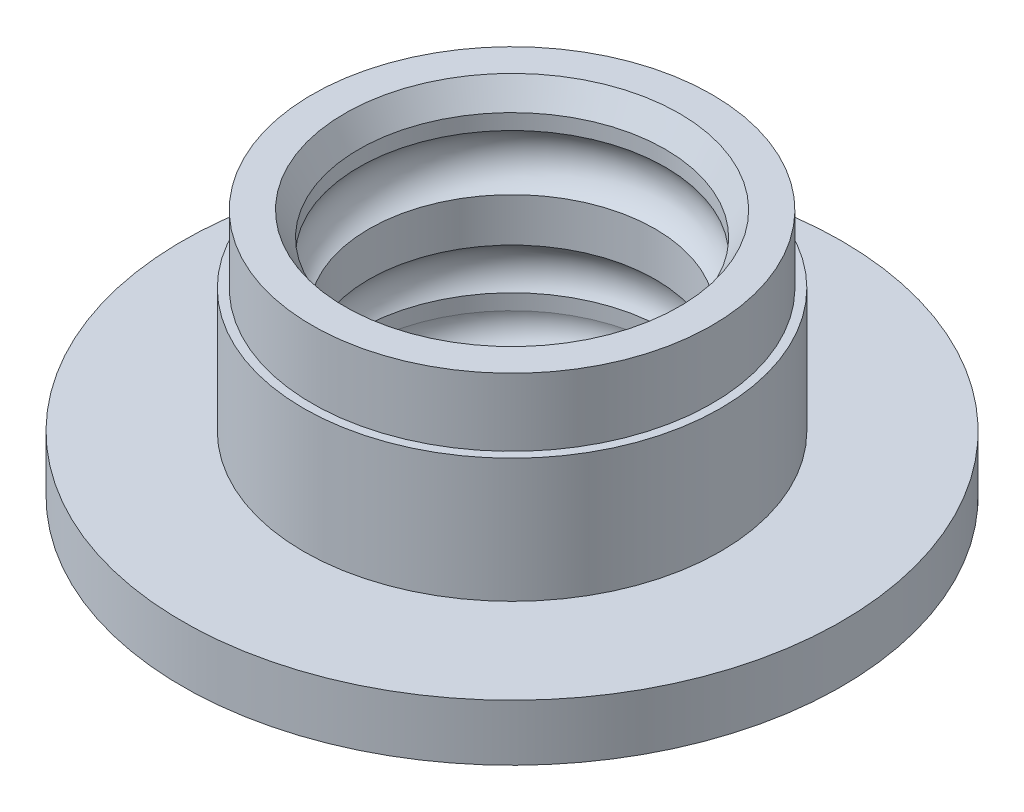
ISO-10303-21;
HEADER;
FILE_DESCRIPTION(('STEP AP214'),'2;1');
FILE_NAME('part.step','',(''),(''),'','','');
FILE_SCHEMA(('AUTOMOTIVE_DESIGN { 1 0 10303 214 1 1 1 1 }'));
ENDSEC;
DATA;
#1=APPLICATION_CONTEXT('core data for automotive mechanical design processes');
#2=APPLICATION_PROTOCOL_DEFINITION('international standard','automotive_design',2000,#1);
#3=PRODUCT_CONTEXT('',#1,'mechanical');
#4=PRODUCT('Part','Part','',(#3));
#5=PRODUCT_RELATED_PRODUCT_CATEGORY('part','',(#4));
#6=PRODUCT_DEFINITION_FORMATION('','',#4);
#7=PRODUCT_DEFINITION_CONTEXT('part definition',#1,'design');
#8=PRODUCT_DEFINITION('design','',#6,#7);
#9=PRODUCT_DEFINITION_SHAPE('','',#8);
#10=(LENGTH_UNIT() NAMED_UNIT(*) SI_UNIT(.MILLI.,.METRE.));
#11=(NAMED_UNIT(*) PLANE_ANGLE_UNIT() SI_UNIT($,.RADIAN.));
#12=(NAMED_UNIT(*) SI_UNIT($,.STERADIAN.) SOLID_ANGLE_UNIT());
#13=UNCERTAINTY_MEASURE_WITH_UNIT(LENGTH_MEASURE(1.E-05),#10,'distance_accuracy_value','');
#14=(GEOMETRIC_REPRESENTATION_CONTEXT(3) GLOBAL_UNCERTAINTY_ASSIGNED_CONTEXT((#13)) GLOBAL_UNIT_ASSIGNED_CONTEXT((#10,
#11,#12)) REPRESENTATION_CONTEXT('',''));
#15=CARTESIAN_POINT('',(0.,0.,0.));
#16=DIRECTION('',(0.,0.,1.));
#17=DIRECTION('',(1.,0.,0.));
#18=AXIS2_PLACEMENT_3D('',#15,#16,#17);
#19=CARTESIAN_POINT('',(35.5,1.7405594653392,0.));
#20=DIRECTION('',(0.,1.,0.));
#21=DIRECTION('',(0.,0.,1.));
#22=AXIS2_PLACEMENT_3D('',#19,#20,#21);
#23=PLANE('',#22);
#24=CARTESIAN_POINT('',(0.,1.7405594653392,0.));
#25=DIRECTION('',(0.,-1.,0.));
#26=DIRECTION('',(0.,0.,-1.));
#27=AXIS2_PLACEMENT_3D('',#24,#25,#26);
#28=CIRCLE('',#27,35.5);
#29=CARTESIAN_POINT('',(0.,1.7405594653392,-35.5));
#30=VERTEX_POINT('',#29);
#31=EDGE_CURVE('E10',#30,#30,#28,.T.);
#32=ORIENTED_EDGE('',*,*,#31,.T.);
#33=EDGE_LOOP('',(#32));
#34=FACE_BOUND('',#33,.T.);
#35=CARTESIAN_POINT('',(0.,1.7405594653392,0.));
#36=DIRECTION('',(0.,-1.,0.));
#37=DIRECTION('',(0.,0.,-1.));
#38=AXIS2_PLACEMENT_3D('',#35,#36,#37);
#39=CIRCLE('',#38,37.);
#40=CARTESIAN_POINT('',(0.,1.7405594653392,-37.));
#41=VERTEX_POINT('',#40);
#42=EDGE_CURVE('E98',#41,#41,#39,.T.);
#43=ORIENTED_EDGE('',*,*,#42,.F.);
#44=EDGE_LOOP('',(#43));
#45=FACE_BOUND('',#44,.T.);
#46=ADVANCED_FACE('F31',(#34,#45),#23,.T.);
#47=CARTESIAN_POINT('',(0.,-64.8430626057529,0.));
#48=DIRECTION('',(0.,-1.,0.));
#49=DIRECTION('',(0.,0.,-1.));
#50=AXIS2_PLACEMENT_3D('',#47,#48,#49);
#51=CYLINDRICAL_SURFACE('',#50,35.5);
#52=CARTESIAN_POINT('',(0.,13.7405594653392,0.));
#53=DIRECTION('',(0.,-1.,0.));
#54=DIRECTION('',(0.,0.,-1.));
#55=AXIS2_PLACEMENT_3D('',#52,#53,#54);
#56=CIRCLE('',#55,35.5);
#57=CARTESIAN_POINT('',(0.,13.7405594653392,-35.5));
#58=VERTEX_POINT('',#57);
#59=EDGE_CURVE('E37',#58,#58,#56,.T.);
#60=ORIENTED_EDGE('',*,*,#59,.T.);
#61=EDGE_LOOP('',(#60));
#62=FACE_BOUND('',#61,.T.);
#63=ORIENTED_EDGE('',*,*,#31,.F.);
#64=EDGE_LOOP('',(#63));
#65=FACE_BOUND('',#64,.T.);
#66=ADVANCED_FACE('F106',(#62,#65),#51,.T.);
#67=CARTESIAN_POINT('',(29.7,13.7405594653392,0.));
#68=DIRECTION('',(0.,1.,0.));
#69=DIRECTION('',(0.,0.,1.));
#70=AXIS2_PLACEMENT_3D('',#67,#68,#69);
#71=PLANE('',#70);
#72=CARTESIAN_POINT('',(0.,13.7405594653392,0.));
#73=DIRECTION('',(0.,-1.,0.));
#74=DIRECTION('',(0.,0.,-1.));
#75=AXIS2_PLACEMENT_3D('',#72,#73,#74);
#76=CIRCLE('',#75,29.7);
#77=CARTESIAN_POINT('',(0.,13.7405594653392,-29.7));
#78=VERTEX_POINT('',#77);
#79=EDGE_CURVE('E41',#78,#78,#76,.T.);
#80=ORIENTED_EDGE('',*,*,#79,.T.);
#81=EDGE_LOOP('',(#80));
#82=FACE_BOUND('',#81,.T.);
#83=ORIENTED_EDGE('',*,*,#59,.F.);
#84=EDGE_LOOP('',(#83));
#85=FACE_BOUND('',#84,.T.);
#86=ADVANCED_FACE('F110',(#82,#85),#71,.T.);
#87=CARTESIAN_POINT('',(0.,13.7405594653392,0.));
#88=DIRECTION('',(0.,1.,0.));
#89=DIRECTION('',(0.,0.,1.));
#90=AXIS2_PLACEMENT_3D('',#87,#88,#89);
#91=CONICAL_SURFACE('',#90,29.7,0.533624722812647);
#92=CARTESIAN_POINT('',(0.,9.49055946533919,0.));
#93=DIRECTION('',(0.,-1.,0.));
#94=DIRECTION('',(0.,0.,-1.));
#95=AXIS2_PLACEMENT_3D('',#92,#93,#94);
#96=CIRCLE('',#95,27.1891149492495);
#97=CARTESIAN_POINT('',(0.,9.49055946533919,-27.1891149492495));
#98=VERTEX_POINT('',#97);
#99=EDGE_CURVE('E45',#98,#98,#96,.T.);
#100=ORIENTED_EDGE('',*,*,#99,.T.);
#101=EDGE_LOOP('',(#100));
#102=FACE_BOUND('',#101,.T.);
#103=ORIENTED_EDGE('',*,*,#79,.F.);
#104=EDGE_LOOP('',(#103));
#105=FACE_BOUND('',#104,.T.);
#106=ADVANCED_FACE('F114',(#102,#105),#91,.F.);
#107=CARTESIAN_POINT('',(0.,-64.8430626057529,0.));
#108=DIRECTION('',(0.,-1.,0.));
#109=DIRECTION('',(0.,0.,-1.));
#110=AXIS2_PLACEMENT_3D('',#107,#108,#109);
#111=CYLINDRICAL_SURFACE('',#110,27.1891149492495);
#112=CARTESIAN_POINT('',(0.,6.74055946533919,0.));
#113=DIRECTION('',(0.,-1.,0.));
#114=DIRECTION('',(0.,0.,-1.));
#115=AXIS2_PLACEMENT_3D('',#112,#113,#114);
#116=CIRCLE('',#115,27.1891149492495);
#117=CARTESIAN_POINT('',(0.,6.74055946533919,-27.1891149492495));
#118=VERTEX_POINT('',#117);
#119=EDGE_CURVE('E50',#118,#118,#116,.T.);
#120=ORIENTED_EDGE('',*,*,#119,.T.);
#121=EDGE_LOOP('',(#120));
#122=FACE_BOUND('',#121,.T.);
#123=ORIENTED_EDGE('',*,*,#99,.F.);
#124=EDGE_LOOP('',(#123));
#125=FACE_BOUND('',#124,.T.);
#126=ADVANCED_FACE('F121',(#122,#125),#111,.F.);
#127=CARTESIAN_POINT('',(0.,3.19642096882552,0.));
#128=DIRECTION('',(0.,-1.,0.));
#129=DIRECTION('',(0.,0.,-1.));
#130=AXIS2_PLACEMENT_3D('',#127,#128,#129);
#131=TOROIDAL_SURFACE('',#130,22.6612476458129,5.75);
#132=CARTESIAN_POINT('',(0.,-1.85944053466081,0.));
#133=DIRECTION('',(0.,-1.,0.));
#134=DIRECTION('',(0.,0.,-1.));
#135=AXIS2_PLACEMENT_3D('',#132,#133,#134);
#136=CIRCLE('',#135,25.4);
#137=CARTESIAN_POINT('',(0.,-1.85944053466081,-25.4));
#138=VERTEX_POINT('',#137);
#139=EDGE_CURVE('E53',#138,#138,#136,.T.);
#140=ORIENTED_EDGE('',*,*,#139,.T.);
#141=EDGE_LOOP('',(#140));
#142=FACE_BOUND('',#141,.T.);
#143=ORIENTED_EDGE('',*,*,#119,.F.);
#144=EDGE_LOOP('',(#143));
#145=FACE_BOUND('',#144,.T.);
#146=ADVANCED_FACE('F125',(#142,#145),#131,.F.);
#147=CARTESIAN_POINT('',(0.,-64.8430626057529,0.));
#148=DIRECTION('',(0.,-1.,0.));
#149=DIRECTION('',(0.,0.,-1.));
#150=AXIS2_PLACEMENT_3D('',#147,#148,#149);
#151=CYLINDRICAL_SURFACE('',#150,25.4);
#152=CARTESIAN_POINT('',(0.,-9.6094405346608,0.));
#153=DIRECTION('',(0.,-1.,0.));
#154=DIRECTION('',(0.,0.,-1.));
#155=AXIS2_PLACEMENT_3D('',#152,#153,#154);
#156=CIRCLE('',#155,25.4);
#157=CARTESIAN_POINT('',(0.,-9.6094405346608,-25.4));
#158=VERTEX_POINT('',#157);
#159=EDGE_CURVE('E56',#158,#158,#156,.T.);
#160=ORIENTED_EDGE('',*,*,#159,.T.);
#161=EDGE_LOOP('',(#160));
#162=FACE_BOUND('',#161,.T.);
#163=ORIENTED_EDGE('',*,*,#139,.F.);
#164=EDGE_LOOP('',(#163));
#165=FACE_BOUND('',#164,.T.);
#166=ADVANCED_FACE('F129',(#162,#165),#151,.F.);
#167=CARTESIAN_POINT('',(0.,-14.6653020381471,0.));
#168=DIRECTION('',(0.,-1.,0.));
#169=DIRECTION('',(0.,0.,-1.));
#170=AXIS2_PLACEMENT_3D('',#167,#168,#169);
#171=TOROIDAL_SURFACE('',#170,22.6612476458129,5.75);
#172=CARTESIAN_POINT('',(0.,-18.2094405346608,0.));
#173=DIRECTION('',(0.,-1.,0.));
#174=DIRECTION('',(0.,0.,-1.));
#175=AXIS2_PLACEMENT_3D('',#172,#173,#174);
#176=CIRCLE('',#175,27.1891149492495);
#177=CARTESIAN_POINT('',(0.,-18.2094405346608,-27.1891149492495));
#178=VERTEX_POINT('',#177);
#179=EDGE_CURVE('E59',#178,#178,#176,.T.);
#180=ORIENTED_EDGE('',*,*,#179,.T.);
#181=EDGE_LOOP('',(#180));
#182=FACE_BOUND('',#181,.T.);
#183=ORIENTED_EDGE('',*,*,#159,.F.);
#184=EDGE_LOOP('',(#183));
#185=FACE_BOUND('',#184,.T.);
#186=ADVANCED_FACE('F133',(#182,#185),#171,.F.);
#187=CARTESIAN_POINT('',(0.,-64.8430626057529,0.));
#188=DIRECTION('',(0.,-1.,0.));
#189=DIRECTION('',(0.,0.,-1.));
#190=AXIS2_PLACEMENT_3D('',#187,#188,#189);
#191=CYLINDRICAL_SURFACE('',#190,27.1891149492495);
#192=CARTESIAN_POINT('',(0.,-20.9594405346608,0.));
#193=DIRECTION('',(0.,-1.,0.));
#194=DIRECTION('',(0.,0.,-1.));
#195=AXIS2_PLACEMENT_3D('',#192,#193,#194);
#196=CIRCLE('',#195,27.1891149492495);
#197=CARTESIAN_POINT('',(0.,-20.9594405346608,-27.1891149492495));
#198=VERTEX_POINT('',#197);
#199=EDGE_CURVE('E62',#198,#198,#196,.T.);
#200=ORIENTED_EDGE('',*,*,#199,.T.);
#201=EDGE_LOOP('',(#200));
#202=FACE_BOUND('',#201,.T.);
#203=ORIENTED_EDGE('',*,*,#179,.F.);
#204=EDGE_LOOP('',(#203));
#205=FACE_BOUND('',#204,.T.);
#206=ADVANCED_FACE('F137',(#202,#205),#191,.F.);
#207=CARTESIAN_POINT('',(0.,-21.908439755999,0.));
#208=DIRECTION('',(0.,-1.,0.));
#209=DIRECTION('',(0.,0.,-1.));
#210=AXIS2_PLACEMENT_3D('',#207,#208,#209);
#211=TOROIDAL_SURFACE('',#210,22.280000927565,5.);
#212=CARTESIAN_POINT('',(0.,-25.4594405346608,0.));
#213=DIRECTION('',(0.,-1.,0.));
#214=DIRECTION('',(0.,0.,-1.));
#215=AXIS2_PLACEMENT_3D('',#212,#213,#214);
#216=CIRCLE('',#215,25.8);
#217=CARTESIAN_POINT('',(0.,-25.4594405346608,-25.8));
#218=VERTEX_POINT('',#217);
#219=EDGE_CURVE('E65',#218,#218,#216,.T.);
#220=ORIENTED_EDGE('',*,*,#219,.T.);
#221=EDGE_LOOP('',(#220));
#222=FACE_BOUND('',#221,.T.);
#223=ORIENTED_EDGE('',*,*,#199,.F.);
#224=EDGE_LOOP('',(#223));
#225=FACE_BOUND('',#224,.T.);
#226=ADVANCED_FACE('F141',(#222,#225),#211,.F.);
#227=CARTESIAN_POINT('',(0.,-64.8430626057529,0.));
#228=DIRECTION('',(0.,-1.,0.));
#229=DIRECTION('',(0.,0.,-1.));
#230=AXIS2_PLACEMENT_3D('',#227,#228,#229);
#231=CYLINDRICAL_SURFACE('',#230,25.8);
#232=CARTESIAN_POINT('',(0.,-36.2594405346608,0.));
#233=DIRECTION('',(0.,-1.,0.));
#234=DIRECTION('',(0.,0.,-1.));
#235=AXIS2_PLACEMENT_3D('',#232,#233,#234);
#236=CIRCLE('',#235,25.8);
#237=CARTESIAN_POINT('',(0.,-36.2594405346608,-25.8));
#238=VERTEX_POINT('',#237);
#239=EDGE_CURVE('E68',#238,#238,#236,.T.);
#240=ORIENTED_EDGE('',*,*,#239,.T.);
#241=EDGE_LOOP('',(#240));
#242=FACE_BOUND('',#241,.T.);
#243=ORIENTED_EDGE('',*,*,#219,.F.);
#244=EDGE_LOOP('',(#243));
#245=FACE_BOUND('',#244,.T.);
#246=ADVANCED_FACE('F145',(#242,#245),#231,.F.);
#247=CARTESIAN_POINT('',(26.,-36.2594405346608,0.));
#248=DIRECTION('',(0.,-1.,0.));
#249=DIRECTION('',(0.,0.,-1.));
#250=AXIS2_PLACEMENT_3D('',#247,#248,#249);
#251=PLANE('',#250);
#252=CARTESIAN_POINT('',(0.,-36.2594405346608,0.));
#253=DIRECTION('',(0.,-1.,0.));
#254=DIRECTION('',(0.,0.,-1.));
#255=AXIS2_PLACEMENT_3D('',#252,#253,#254);
#256=CIRCLE('',#255,26.);
#257=CARTESIAN_POINT('',(0.,-36.2594405346608,-26.));
#258=VERTEX_POINT('',#257);
#259=EDGE_CURVE('E71',#258,#258,#256,.T.);
#260=ORIENTED_EDGE('',*,*,#259,.T.);
#261=EDGE_LOOP('',(#260));
#262=FACE_BOUND('',#261,.T.);
#263=ORIENTED_EDGE('',*,*,#239,.F.);
#264=EDGE_LOOP('',(#263));
#265=FACE_BOUND('',#264,.T.);
#266=ADVANCED_FACE('F149',(#262,#265),#251,.T.);
#267=CARTESIAN_POINT('',(0.,-64.8430626057529,0.));
#268=DIRECTION('',(0.,-1.,0.));
#269=DIRECTION('',(0.,0.,-1.));
#270=AXIS2_PLACEMENT_3D('',#267,#268,#269);
#271=CYLINDRICAL_SURFACE('',#270,26.);
#272=CARTESIAN_POINT('',(0.,-47.2594405346608,0.));
#273=DIRECTION('',(0.,-1.,0.));
#274=DIRECTION('',(0.,0.,-1.));
#275=AXIS2_PLACEMENT_3D('',#272,#273,#274);
#276=CIRCLE('',#275,26.);
#277=CARTESIAN_POINT('',(0.,-47.2594405346608,-26.));
#278=VERTEX_POINT('',#277);
#279=EDGE_CURVE('E74',#278,#278,#276,.T.);
#280=ORIENTED_EDGE('',*,*,#279,.T.);
#281=EDGE_LOOP('',(#280));
#282=FACE_BOUND('',#281,.T.);
#283=ORIENTED_EDGE('',*,*,#259,.F.);
#284=EDGE_LOOP('',(#283));
#285=FACE_BOUND('',#284,.T.);
#286=ADVANCED_FACE('F153',(#282,#285),#271,.F.);
#287=CARTESIAN_POINT('',(29.,-47.2594405346608,0.));
#288=DIRECTION('',(0.,-1.,0.));
#289=DIRECTION('',(0.,0.,-1.));
#290=AXIS2_PLACEMENT_3D('',#287,#288,#289);
#291=PLANE('',#290);
#292=CARTESIAN_POINT('',(0.,-47.2594405346608,0.));
#293=DIRECTION('',(0.,-1.,0.));
#294=DIRECTION('',(0.,0.,-1.));
#295=AXIS2_PLACEMENT_3D('',#292,#293,#294);
#296=CIRCLE('',#295,29.);
#297=CARTESIAN_POINT('',(0.,-47.2594405346608,-29.));
#298=VERTEX_POINT('',#297);
#299=EDGE_CURVE('E77',#298,#298,#296,.T.);
#300=ORIENTED_EDGE('',*,*,#299,.T.);
#301=EDGE_LOOP('',(#300));
#302=FACE_BOUND('',#301,.T.);
#303=ORIENTED_EDGE('',*,*,#279,.F.);
#304=EDGE_LOOP('',(#303));
#305=FACE_BOUND('',#304,.T.);
#306=ADVANCED_FACE('F157',(#302,#305),#291,.T.);
#307=CARTESIAN_POINT('',(0.,-64.8430626057529,0.));
#308=DIRECTION('',(0.,-1.,0.));
#309=DIRECTION('',(0.,0.,-1.));
#310=AXIS2_PLACEMENT_3D('',#307,#308,#309);
#311=CYLINDRICAL_SURFACE('',#310,29.);
#312=CARTESIAN_POINT('',(0.,-35.2594405346608,0.));
#313=DIRECTION('',(0.,-1.,0.));
#314=DIRECTION('',(0.,0.,-1.));
#315=AXIS2_PLACEMENT_3D('',#312,#313,#314);
#316=CIRCLE('',#315,29.);
#317=CARTESIAN_POINT('',(0.,-35.2594405346608,-29.));
#318=VERTEX_POINT('',#317);
#319=EDGE_CURVE('E80',#318,#318,#316,.T.);
#320=ORIENTED_EDGE('',*,*,#319,.T.);
#321=EDGE_LOOP('',(#320));
#322=FACE_BOUND('',#321,.T.);
#323=ORIENTED_EDGE('',*,*,#299,.F.);
#324=EDGE_LOOP('',(#323));
#325=FACE_BOUND('',#324,.T.);
#326=ADVANCED_FACE('F161',(#322,#325),#311,.T.);
#327=CARTESIAN_POINT('',(29.5,-35.2594405346608,0.));
#328=DIRECTION('',(0.,-1.,0.));
#329=DIRECTION('',(0.,0.,-1.));
#330=AXIS2_PLACEMENT_3D('',#327,#328,#329);
#331=PLANE('',#330);
#332=CARTESIAN_POINT('',(0.,-35.2594405346608,0.));
#333=DIRECTION('',(0.,-1.,0.));
#334=DIRECTION('',(0.,0.,-1.));
#335=AXIS2_PLACEMENT_3D('',#332,#333,#334);
#336=CIRCLE('',#335,29.5);
#337=CARTESIAN_POINT('',(0.,-35.2594405346608,-29.5));
#338=VERTEX_POINT('',#337);
#339=EDGE_CURVE('E83',#338,#338,#336,.T.);
#340=ORIENTED_EDGE('',*,*,#339,.T.);
#341=EDGE_LOOP('',(#340));
#342=FACE_BOUND('',#341,.T.);
#343=ORIENTED_EDGE('',*,*,#319,.F.);
#344=EDGE_LOOP('',(#343));
#345=FACE_BOUND('',#344,.T.);
#346=ADVANCED_FACE('F165',(#342,#345),#331,.T.);
#347=CARTESIAN_POINT('',(0.,-64.8430626057529,0.));
#348=DIRECTION('',(0.,-1.,0.));
#349=DIRECTION('',(0.,0.,-1.));
#350=AXIS2_PLACEMENT_3D('',#347,#348,#349);
#351=CYLINDRICAL_SURFACE('',#350,29.5);
#352=CARTESIAN_POINT('',(0.,-30.2594405346608,0.));
#353=DIRECTION('',(0.,-1.,0.));
#354=DIRECTION('',(0.,0.,-1.));
#355=AXIS2_PLACEMENT_3D('',#352,#353,#354);
#356=CIRCLE('',#355,29.5);
#357=CARTESIAN_POINT('',(0.,-30.2594405346608,-29.5));
#358=VERTEX_POINT('',#357);
#359=EDGE_CURVE('E86',#358,#358,#356,.T.);
#360=ORIENTED_EDGE('',*,*,#359,.T.);
#361=EDGE_LOOP('',(#360));
#362=FACE_BOUND('',#361,.T.);
#363=ORIENTED_EDGE('',*,*,#339,.F.);
#364=EDGE_LOOP('',(#363));
#365=FACE_BOUND('',#364,.T.);
#366=ADVANCED_FACE('F169',(#362,#365),#351,.T.);
#367=CARTESIAN_POINT('',(58.5,-30.2594405346608,0.));
#368=DIRECTION('',(0.,-1.,0.));
#369=DIRECTION('',(0.,0.,-1.));
#370=AXIS2_PLACEMENT_3D('',#367,#368,#369);
#371=PLANE('',#370);
#372=CARTESIAN_POINT('',(0.,-30.2594405346608,0.));
#373=DIRECTION('',(0.,-1.,0.));
#374=DIRECTION('',(0.,0.,-1.));
#375=AXIS2_PLACEMENT_3D('',#372,#373,#374);
#376=CIRCLE('',#375,58.5);
#377=CARTESIAN_POINT('',(0.,-30.2594405346608,-58.5));
#378=VERTEX_POINT('',#377);
#379=EDGE_CURVE('E89',#378,#378,#376,.T.);
#380=ORIENTED_EDGE('',*,*,#379,.T.);
#381=EDGE_LOOP('',(#380));
#382=FACE_BOUND('',#381,.T.);
#383=ORIENTED_EDGE('',*,*,#359,.F.);
#384=EDGE_LOOP('',(#383));
#385=FACE_BOUND('',#384,.T.);
#386=ADVANCED_FACE('F173',(#382,#385),#371,.T.);
#387=CARTESIAN_POINT('',(0.,-64.8430626057529,0.));
#388=DIRECTION('',(0.,-1.,0.));
#389=DIRECTION('',(0.,0.,-1.));
#390=AXIS2_PLACEMENT_3D('',#387,#388,#389);
#391=CYLINDRICAL_SURFACE('',#390,58.5);
#392=CARTESIAN_POINT('',(0.,-20.2594405346608,0.));
#393=DIRECTION('',(0.,-1.,0.));
#394=DIRECTION('',(0.,0.,-1.));
#395=AXIS2_PLACEMENT_3D('',#392,#393,#394);
#396=CIRCLE('',#395,58.5);
#397=CARTESIAN_POINT('',(0.,-20.2594405346608,-58.5));
#398=VERTEX_POINT('',#397);
#399=EDGE_CURVE('E92',#398,#398,#396,.T.);
#400=ORIENTED_EDGE('',*,*,#399,.T.);
#401=EDGE_LOOP('',(#400));
#402=FACE_BOUND('',#401,.T.);
#403=ORIENTED_EDGE('',*,*,#379,.F.);
#404=EDGE_LOOP('',(#403));
#405=FACE_BOUND('',#404,.T.);
#406=ADVANCED_FACE('F177',(#402,#405),#391,.T.);
#407=CARTESIAN_POINT('',(37.,-20.2594405346608,0.));
#408=DIRECTION('',(0.,1.,0.));
#409=DIRECTION('',(0.,0.,1.));
#410=AXIS2_PLACEMENT_3D('',#407,#408,#409);
#411=PLANE('',#410);
#412=CARTESIAN_POINT('',(0.,-20.2594405346608,0.));
#413=DIRECTION('',(0.,-1.,0.));
#414=DIRECTION('',(0.,0.,-1.));
#415=AXIS2_PLACEMENT_3D('',#412,#413,#414);
#416=CIRCLE('',#415,37.);
#417=CARTESIAN_POINT('',(0.,-20.2594405346608,-37.));
#418=VERTEX_POINT('',#417);
#419=EDGE_CURVE('E95',#418,#418,#416,.T.);
#420=ORIENTED_EDGE('',*,*,#419,.T.);
#421=EDGE_LOOP('',(#420));
#422=FACE_BOUND('',#421,.T.);
#423=ORIENTED_EDGE('',*,*,#399,.F.);
#424=EDGE_LOOP('',(#423));
#425=FACE_BOUND('',#424,.T.);
#426=ADVANCED_FACE('F181',(#422,#425),#411,.T.);
#427=CARTESIAN_POINT('',(0.,-64.8430626057529,0.));
#428=DIRECTION('',(0.,-1.,0.));
#429=DIRECTION('',(0.,0.,-1.));
#430=AXIS2_PLACEMENT_3D('',#427,#428,#429);
#431=CYLINDRICAL_SURFACE('',#430,37.);
#432=ORIENTED_EDGE('',*,*,#42,.T.);
#433=EDGE_LOOP('',(#432));
#434=FACE_BOUND('',#433,.T.);
#435=ORIENTED_EDGE('',*,*,#419,.F.);
#436=EDGE_LOOP('',(#435));
#437=FACE_BOUND('',#436,.T.);
#438=ADVANCED_FACE('F102',(#434,#437),#431,.T.);
#439=CLOSED_SHELL('',(#46,#66,#86,#106,#126,#146,#166,#186,#206,#226,#246,#266,#286,#306,#326,
#346,#366,#386,#406,#426,#438));
#440=MANIFOLD_SOLID_BREP('B2',#439);
#441=ADVANCED_BREP_SHAPE_REPRESENTATION('',(#18,#440),#14);
#442=SHAPE_DEFINITION_REPRESENTATION(#9,#441);
ENDSEC;
END-ISO-10303-21;
